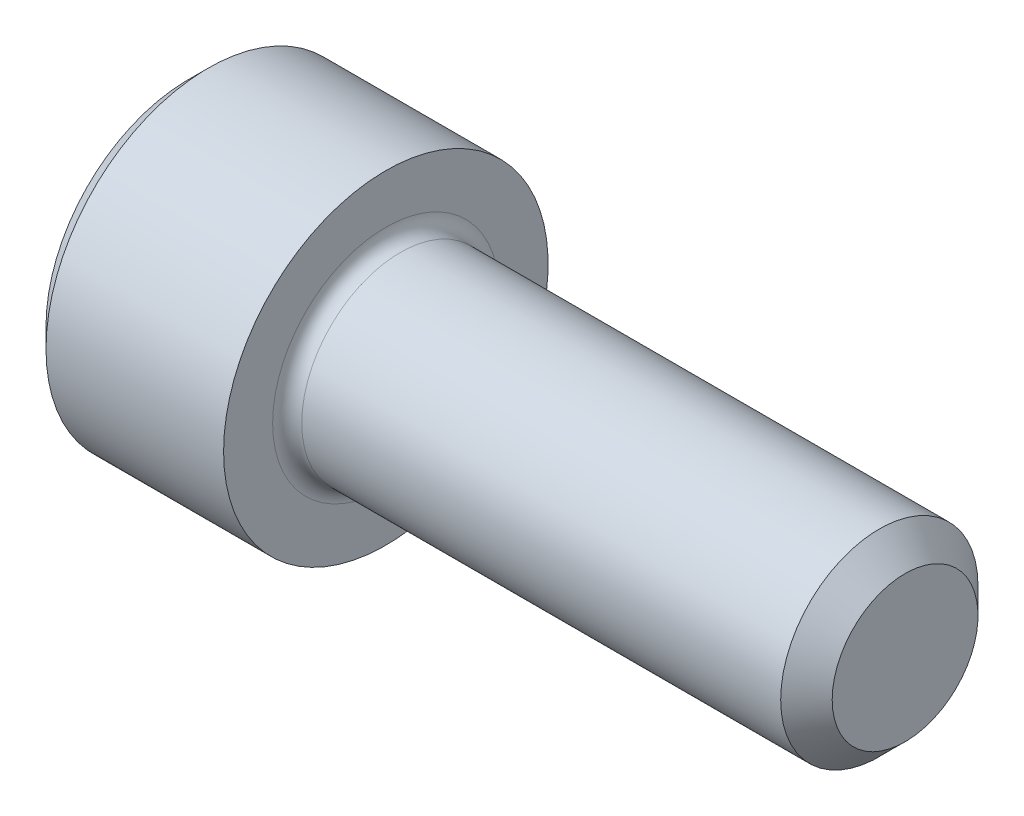
ISO-10303-21;
HEADER;
FILE_DESCRIPTION(('STEP AP214'),'2;1');
FILE_NAME('part.step','',(''),(''),'','','');
FILE_SCHEMA(('AUTOMOTIVE_DESIGN { 1 0 10303 214 1 1 1 1 }'));
ENDSEC;
DATA;
#1=APPLICATION_CONTEXT('core data for automotive mechanical design processes');
#2=APPLICATION_PROTOCOL_DEFINITION('international standard','automotive_design',2000,#1);
#3=PRODUCT_CONTEXT('',#1,'mechanical');
#4=PRODUCT('Part','Part','',(#3));
#5=PRODUCT_RELATED_PRODUCT_CATEGORY('part','',(#4));
#6=PRODUCT_DEFINITION_FORMATION('','',#4);
#7=PRODUCT_DEFINITION_CONTEXT('part definition',#1,'design');
#8=PRODUCT_DEFINITION('design','',#6,#7);
#9=PRODUCT_DEFINITION_SHAPE('','',#8);
#10=(LENGTH_UNIT() NAMED_UNIT(*) SI_UNIT(.MILLI.,.METRE.));
#11=(NAMED_UNIT(*) PLANE_ANGLE_UNIT() SI_UNIT($,.RADIAN.));
#12=(NAMED_UNIT(*) SI_UNIT($,.STERADIAN.) SOLID_ANGLE_UNIT());
#13=UNCERTAINTY_MEASURE_WITH_UNIT(LENGTH_MEASURE(1.E-05),#10,'distance_accuracy_value','');
#14=(GEOMETRIC_REPRESENTATION_CONTEXT(3) GLOBAL_UNCERTAINTY_ASSIGNED_CONTEXT((#13)) GLOBAL_UNIT_ASSIGNED_CONTEXT((#10,
#11,#12)) REPRESENTATION_CONTEXT('',''));
#15=CARTESIAN_POINT('',(0.,0.,0.));
#16=DIRECTION('',(0.,0.,1.));
#17=DIRECTION('',(1.,0.,0.));
#18=AXIS2_PLACEMENT_3D('',#15,#16,#17);
#19=CARTESIAN_POINT('',(0.,0.,0.));
#20=DIRECTION('',(-1.,0.,0.));
#21=DIRECTION('',(0.,0.,1.));
#22=AXIS2_PLACEMENT_3D('',#19,#20,#21);
#23=PLANE('',#22);
#24=DIRECTION('',(0.,-0.499999999999999,0.86602540378444));
#25=VECTOR('',#24,1.);
#26=CARTESIAN_POINT('',(0.,2.2920921156882,0.));
#27=LINE('',#26,#25);
#28=CARTESIAN_POINT('',(0.,2.2920921156882,0.));
#29=VERTEX_POINT('',#28);
#30=CARTESIAN_POINT('',(0.,1.1460460578441,1.98501000000001));
#31=VERTEX_POINT('',#30);
#32=EDGE_CURVE('E392',#29,#31,#27,.T.);
#33=ORIENTED_EDGE('',*,*,#32,.T.);
#34=DIRECTION('',(0.,1.,0.));
#35=VECTOR('',#34,1.);
#36=CARTESIAN_POINT('',(0.,-1.1460460578441,1.98501000000001));
#37=LINE('',#36,#35);
#38=CARTESIAN_POINT('',(0.,-1.1460460578441,1.98501000000001));
#39=VERTEX_POINT('',#38);
#40=EDGE_CURVE('E128',#39,#31,#37,.T.);
#41=ORIENTED_EDGE('',*,*,#40,.F.);
#42=DIRECTION('',(0.,-0.500000000000001,-0.866025403784438));
#43=VECTOR('',#42,1.);
#44=CARTESIAN_POINT('',(0.,-1.1460460578441,1.98501000000001));
#45=LINE('',#44,#43);
#46=CARTESIAN_POINT('',(0.,-2.2920921156882,0.));
#47=VERTEX_POINT('',#46);
#48=EDGE_CURVE('E395',#39,#47,#45,.T.);
#49=ORIENTED_EDGE('',*,*,#48,.T.);
#50=DIRECTION('',(0.,0.499999999999999,-0.86602540378444));
#51=VECTOR('',#50,1.);
#52=CARTESIAN_POINT('',(0.,-2.2920921156882,0.));
#53=LINE('',#52,#51);
#54=CARTESIAN_POINT('',(0.,-1.1460460578441,-1.98500999999999));
#55=VERTEX_POINT('',#54);
#56=EDGE_CURVE('E398',#47,#55,#53,.T.);
#57=ORIENTED_EDGE('',*,*,#56,.T.);
#58=DIRECTION('',(0.,-1.,0.));
#59=VECTOR('',#58,1.);
#60=CARTESIAN_POINT('',(0.,1.1460460578441,-1.98501));
#61=LINE('',#60,#59);
#62=CARTESIAN_POINT('',(0.,1.1460460578441,-1.98501));
#63=VERTEX_POINT('',#62);
#64=EDGE_CURVE('E401',#63,#55,#61,.T.);
#65=ORIENTED_EDGE('',*,*,#64,.F.);
#66=DIRECTION('',(0.,-0.500000000000001,-0.866025403784438));
#67=VECTOR('',#66,1.);
#68=CARTESIAN_POINT('',(0.,2.2920921156882,0.));
#69=LINE('',#68,#67);
#70=EDGE_CURVE('E123',#29,#63,#69,.T.);
#71=ORIENTED_EDGE('',*,*,#70,.F.);
#72=EDGE_LOOP('',(#33,#41,#49,#57,#65,#71));
#73=FACE_BOUND('',#72,.T.);
#74=CARTESIAN_POINT('',(0.,0.,0.));
#75=DIRECTION('',(-1.,0.,0.));
#76=DIRECTION('',(0.,0.,1.));
#77=AXIS2_PLACEMENT_3D('',#74,#75,#76);
#78=CIRCLE('',#77,3.48615);
#79=CARTESIAN_POINT('',(0.,0.,3.48615));
#80=VERTEX_POINT('',#79);
#81=EDGE_CURVE('E139',#80,#80,#78,.T.);
#82=ORIENTED_EDGE('',*,*,#81,.T.);
#83=EDGE_LOOP('',(#82));
#84=FACE_BOUND('',#83,.T.);
#85=ADVANCED_FACE('F36',(#73,#84),#23,.T.);
#86=CARTESIAN_POINT('',(17.526,1.78308,0.));
#87=DIRECTION('',(1.,0.,0.));
#88=DIRECTION('',(0.,0.,-1.));
#89=AXIS2_PLACEMENT_3D('',#86,#87,#88);
#90=PLANE('',#89);
#91=CARTESIAN_POINT('',(17.526,0.,0.));
#92=DIRECTION('',(-1.,0.,0.));
#93=DIRECTION('',(0.,0.,1.));
#94=AXIS2_PLACEMENT_3D('',#91,#92,#93);
#95=CIRCLE('',#94,1.78308);
#96=CARTESIAN_POINT('',(17.526,0.,1.78308));
#97=VERTEX_POINT('',#96);
#98=EDGE_CURVE('E152',#97,#97,#95,.T.);
#99=ORIENTED_EDGE('',*,*,#98,.F.);
#100=EDGE_LOOP('',(#99));
#101=FACE_BOUND('',#100,.T.);
#102=ADVANCED_FACE('F173',(#101),#90,.T.);
#103=CARTESIAN_POINT('',(17.526,0.,0.));
#104=DIRECTION('',(-1.,0.,0.));
#105=DIRECTION('',(0.,0.,1.));
#106=AXIS2_PLACEMENT_3D('',#103,#104,#105);
#107=CONICAL_SURFACE('',#106,1.78308,0.785398163397418);
#108=CARTESIAN_POINT('',(16.89608,0.,0.));
#109=DIRECTION('',(-1.,0.,0.));
#110=DIRECTION('',(0.,0.,1.));
#111=AXIS2_PLACEMENT_3D('',#108,#109,#110);
#112=CIRCLE('',#111,2.41299999999997);
#113=CARTESIAN_POINT('',(16.89608,0.,2.41299999999997));
#114=VERTEX_POINT('',#113);
#115=EDGE_CURVE('E149',#114,#114,#112,.T.);
#116=ORIENTED_EDGE('',*,*,#115,.F.);
#117=EDGE_LOOP('',(#116));
#118=FACE_BOUND('',#117,.T.);
#119=ORIENTED_EDGE('',*,*,#98,.T.);
#120=EDGE_LOOP('',(#119));
#121=FACE_BOUND('',#120,.T.);
#122=ADVANCED_FACE('F179',(#118,#121),#107,.T.);
#123=CARTESIAN_POINT('',(-31.75,0.,0.));
#124=DIRECTION('',(-1.,0.,0.));
#125=DIRECTION('',(0.,0.,1.));
#126=AXIS2_PLACEMENT_3D('',#123,#124,#125);
#127=CYLINDRICAL_SURFACE('',#126,2.41299999999998);
#128=CARTESIAN_POINT('',(5.1816,0.,0.));
#129=DIRECTION('',(1.,0.,0.));
#130=DIRECTION('',(0.,0.,-1.));
#131=AXIS2_PLACEMENT_3D('',#128,#129,#130);
#132=CIRCLE('',#131,2.41299999999998);
#133=CARTESIAN_POINT('',(5.1816,0.,-2.41299999999998));
#134=VERTEX_POINT('',#133);
#135=EDGE_CURVE('E11',#134,#134,#132,.T.);
#136=ORIENTED_EDGE('',*,*,#135,.T.);
#137=EDGE_LOOP('',(#136));
#138=FACE_BOUND('',#137,.T.);
#139=ORIENTED_EDGE('',*,*,#115,.T.);
#140=EDGE_LOOP('',(#139));
#141=FACE_BOUND('',#140,.T.);
#142=ADVANCED_FACE('F190',(#138,#141),#127,.T.);
#143=CARTESIAN_POINT('',(4.826,3.96875,0.));
#144=DIRECTION('',(1.,0.,0.));
#145=DIRECTION('',(0.,0.,-1.));
#146=AXIS2_PLACEMENT_3D('',#143,#144,#145);
#147=PLANE('',#146);
#148=CARTESIAN_POINT('',(4.826,0.,0.));
#149=DIRECTION('',(1.,0.,0.));
#150=DIRECTION('',(0.,0.,-1.));
#151=AXIS2_PLACEMENT_3D('',#148,#149,#150);
#152=CIRCLE('',#151,2.76859999999998);
#153=CARTESIAN_POINT('',(4.826,0.,-2.76859999999998));
#154=VERTEX_POINT('',#153);
#155=EDGE_CURVE('E44',#154,#154,#152,.F.);
#156=ORIENTED_EDGE('',*,*,#155,.T.);
#157=EDGE_LOOP('',(#156));
#158=FACE_BOUND('',#157,.T.);
#159=CARTESIAN_POINT('',(4.826,0.,0.));
#160=DIRECTION('',(-1.,0.,0.));
#161=DIRECTION('',(0.,0.,1.));
#162=AXIS2_PLACEMENT_3D('',#159,#160,#161);
#163=CIRCLE('',#162,3.96875);
#164=CARTESIAN_POINT('',(4.826,0.,3.96875));
#165=VERTEX_POINT('',#164);
#166=EDGE_CURVE('E146',#165,#165,#163,.T.);
#167=ORIENTED_EDGE('',*,*,#166,.F.);
#168=EDGE_LOOP('',(#167));
#169=FACE_BOUND('',#168,.T.);
#170=ADVANCED_FACE('F157',(#158,#169),#147,.T.);
#171=CARTESIAN_POINT('',(-31.75,0.,0.));
#172=DIRECTION('',(-1.,0.,0.));
#173=DIRECTION('',(0.,0.,1.));
#174=AXIS2_PLACEMENT_3D('',#171,#172,#173);
#175=CYLINDRICAL_SURFACE('',#174,3.96875);
#176=ORIENTED_EDGE('',*,*,#166,.T.);
#177=EDGE_LOOP('',(#176));
#178=FACE_BOUND('',#177,.T.);
#179=CARTESIAN_POINT('',(0.4826,0.,0.));
#180=DIRECTION('',(-1.,0.,0.));
#181=DIRECTION('',(0.,0.,1.));
#182=AXIS2_PLACEMENT_3D('',#179,#180,#181);
#183=CIRCLE('',#182,3.96875);
#184=CARTESIAN_POINT('',(0.4826,0.,3.96875));
#185=VERTEX_POINT('',#184);
#186=EDGE_CURVE('E143',#185,#185,#183,.T.);
#187=ORIENTED_EDGE('',*,*,#186,.F.);
#188=EDGE_LOOP('',(#187));
#189=FACE_BOUND('',#188,.T.);
#190=ADVANCED_FACE('F168',(#178,#189),#175,.T.);
#191=CARTESIAN_POINT('',(0.,0.,0.));
#192=DIRECTION('',(1.,0.,0.));
#193=DIRECTION('',(0.,0.,-1.));
#194=AXIS2_PLACEMENT_3D('',#191,#192,#193);
#195=CONICAL_SURFACE('',#194,3.48615,0.785398163397446);
#196=ORIENTED_EDGE('',*,*,#186,.T.);
#197=EDGE_LOOP('',(#196));
#198=FACE_BOUND('',#197,.T.);
#199=ORIENTED_EDGE('',*,*,#81,.F.);
#200=EDGE_LOOP('',(#199));
#201=FACE_BOUND('',#200,.T.);
#202=ADVANCED_FACE('F161',(#198,#201),#195,.T.);
#203=CARTESIAN_POINT('',(5.1816,0.,0.));
#204=DIRECTION('',(1.,0.,0.));
#205=DIRECTION('',(0.,0.,-1.));
#206=AXIS2_PLACEMENT_3D('',#203,#204,#205);
#207=TOROIDAL_SURFACE('',#206,2.76859999999998,0.3556);
#208=ORIENTED_EDGE('',*,*,#135,.F.);
#209=EDGE_LOOP('',(#208));
#210=FACE_BOUND('',#209,.T.);
#211=ORIENTED_EDGE('',*,*,#155,.F.);
#212=EDGE_LOOP('',(#211));
#213=FACE_BOUND('',#212,.T.);
#214=ADVANCED_FACE('F38',(#210,#213),#207,.F.);
#215=CARTESIAN_POINT('',(2.286,2.2920921156882,0.));
#216=DIRECTION('',(0.,-0.866025403784439,-0.499999999999999));
#217=DIRECTION('',(0.,0.499999999999999,-0.866025403784439));
#218=AXIS2_PLACEMENT_3D('',#215,#216,#217);
#219=PLANE('',#218);
#220=ORIENTED_EDGE('',*,*,#32,.F.);
#221=DIRECTION('',(-1.,0.,0.));
#222=VECTOR('',#221,1.);
#223=CARTESIAN_POINT('',(2.286,2.2920921156882,0.));
#224=LINE('',#223,#222);
#225=CARTESIAN_POINT('',(2.286,2.2920921156882,0.));
#226=VERTEX_POINT('',#225);
#227=EDGE_CURVE('E391',#226,#29,#224,.T.);
#228=ORIENTED_EDGE('',*,*,#227,.F.);
#229=DIRECTION('',(0.,-0.499999999999999,0.86602540378444));
#230=VECTOR('',#229,1.);
#231=CARTESIAN_POINT('',(2.286,2.2920921156882,0.));
#232=LINE('',#231,#230);
#233=CARTESIAN_POINT('',(2.286,1.71906908676615,0.992504999999997));
#234=VERTEX_POINT('',#233);
#235=EDGE_CURVE('E51',#226,#234,#232,.T.);
#236=ORIENTED_EDGE('',*,*,#235,.T.);
#237=CARTESIAN_POINT('',(2.286,1.1460460578441,1.98501000000001));
#238=VERTEX_POINT('',#237);
#239=EDGE_CURVE('E109',#234,#238,#232,.T.);
#240=ORIENTED_EDGE('',*,*,#239,.T.);
#241=DIRECTION('',(-1.,0.,0.));
#242=VECTOR('',#241,1.);
#243=CARTESIAN_POINT('',(2.286,1.1460460578441,1.98501000000001));
#244=LINE('',#243,#242);
#245=EDGE_CURVE('E121',#238,#31,#244,.T.);
#246=ORIENTED_EDGE('',*,*,#245,.T.);
#247=EDGE_LOOP('',(#220,#228,#236,#240,#246));
#248=FACE_BOUND('',#247,.T.);
#249=ADVANCED_FACE('F120',(#248),#219,.T.);
#250=CARTESIAN_POINT('',(2.286,-1.1460460578441,1.98501000000001));
#251=DIRECTION('',(0.,0.,1.));
#252=DIRECTION('',(0.,-1.,0.));
#253=AXIS2_PLACEMENT_3D('',#250,#251,#252);
#254=PLANE('',#253);
#255=ORIENTED_EDGE('',*,*,#40,.T.);
#256=ORIENTED_EDGE('',*,*,#245,.F.);
#257=DIRECTION('',(0.,1.,0.));
#258=VECTOR('',#257,1.);
#259=CARTESIAN_POINT('',(2.286,-1.1460460578441,1.98501000000001));
#260=LINE('',#259,#258);
#261=CARTESIAN_POINT('',(2.286,0.,1.98501000000001));
#262=VERTEX_POINT('',#261);
#263=EDGE_CURVE('E107',#262,#238,#260,.T.);
#264=ORIENTED_EDGE('',*,*,#263,.F.);
#265=CARTESIAN_POINT('',(2.286,-1.1460460578441,1.98501000000001));
#266=VERTEX_POINT('',#265);
#267=EDGE_CURVE('E117',#266,#262,#260,.T.);
#268=ORIENTED_EDGE('',*,*,#267,.F.);
#269=DIRECTION('',(-1.,0.,0.));
#270=VECTOR('',#269,1.);
#271=CARTESIAN_POINT('',(2.286,-1.1460460578441,1.98501000000001));
#272=LINE('',#271,#270);
#273=EDGE_CURVE('E130',#266,#39,#272,.T.);
#274=ORIENTED_EDGE('',*,*,#273,.T.);
#275=EDGE_LOOP('',(#255,#256,#264,#268,#274));
#276=FACE_BOUND('',#275,.T.);
#277=ADVANCED_FACE('F125',(#276),#254,.F.);
#278=CARTESIAN_POINT('',(2.286,-1.1460460578441,1.98501000000001));
#279=DIRECTION('',(0.,0.866025403784438,-0.500000000000001));
#280=DIRECTION('',(0.,0.500000000000001,0.866025403784438));
#281=AXIS2_PLACEMENT_3D('',#278,#279,#280);
#282=PLANE('',#281);
#283=ORIENTED_EDGE('',*,*,#48,.F.);
#284=ORIENTED_EDGE('',*,*,#273,.F.);
#285=DIRECTION('',(0.,-0.500000000000001,-0.866025403784438));
#286=VECTOR('',#285,1.);
#287=CARTESIAN_POINT('',(2.286,-1.1460460578441,1.98501000000001));
#288=LINE('',#287,#286);
#289=CARTESIAN_POINT('',(2.286,-1.71906908676615,0.992505000000004));
#290=VERTEX_POINT('',#289);
#291=EDGE_CURVE('E372',#266,#290,#288,.T.);
#292=ORIENTED_EDGE('',*,*,#291,.T.);
#293=CARTESIAN_POINT('',(2.286,-2.2920921156882,0.));
#294=VERTEX_POINT('',#293);
#295=EDGE_CURVE('E374',#290,#294,#288,.T.);
#296=ORIENTED_EDGE('',*,*,#295,.T.);
#297=DIRECTION('',(-1.,0.,0.));
#298=VECTOR('',#297,1.);
#299=CARTESIAN_POINT('',(2.286,-2.2920921156882,0.));
#300=LINE('',#299,#298);
#301=EDGE_CURVE('E135',#294,#47,#300,.T.);
#302=ORIENTED_EDGE('',*,*,#301,.T.);
#303=EDGE_LOOP('',(#283,#284,#292,#296,#302));
#304=FACE_BOUND('',#303,.T.);
#305=ADVANCED_FACE('F264',(#304),#282,.T.);
#306=CARTESIAN_POINT('',(2.286,-2.2920921156882,0.));
#307=DIRECTION('',(0.,0.866025403784439,0.499999999999998));
#308=DIRECTION('',(0.,-0.499999999999999,0.86602540378444));
#309=AXIS2_PLACEMENT_3D('',#306,#307,#308);
#310=PLANE('',#309);
#311=ORIENTED_EDGE('',*,*,#56,.F.);
#312=ORIENTED_EDGE('',*,*,#301,.F.);
#313=DIRECTION('',(0.,0.499999999999999,-0.86602540378444));
#314=VECTOR('',#313,1.);
#315=CARTESIAN_POINT('',(2.286,-2.2920921156882,0.));
#316=LINE('',#315,#314);
#317=CARTESIAN_POINT('',(2.286,-1.71906908676615,-0.992504999999996));
#318=VERTEX_POINT('',#317);
#319=EDGE_CURVE('E377',#294,#318,#316,.T.);
#320=ORIENTED_EDGE('',*,*,#319,.T.);
#321=CARTESIAN_POINT('',(2.286,-1.1460460578441,-1.98500999999999));
#322=VERTEX_POINT('',#321);
#323=EDGE_CURVE('E381',#318,#322,#316,.T.);
#324=ORIENTED_EDGE('',*,*,#323,.T.);
#325=DIRECTION('',(-1.,0.,0.));
#326=VECTOR('',#325,1.);
#327=CARTESIAN_POINT('',(2.286,-1.1460460578441,-1.98500999999999));
#328=LINE('',#327,#326);
#329=EDGE_CURVE('E410',#322,#55,#328,.T.);
#330=ORIENTED_EDGE('',*,*,#329,.T.);
#331=EDGE_LOOP('',(#311,#312,#320,#324,#330));
#332=FACE_BOUND('',#331,.T.);
#333=ADVANCED_FACE('F272',(#332),#310,.T.);
#334=CARTESIAN_POINT('',(2.286,1.1460460578441,-1.98501));
#335=DIRECTION('',(0.,0.,-1.));
#336=DIRECTION('',(0.,1.,0.));
#337=AXIS2_PLACEMENT_3D('',#334,#335,#336);
#338=PLANE('',#337);
#339=ORIENTED_EDGE('',*,*,#64,.T.);
#340=ORIENTED_EDGE('',*,*,#329,.F.);
#341=DIRECTION('',(0.,-1.,0.));
#342=VECTOR('',#341,1.);
#343=CARTESIAN_POINT('',(2.286,1.1460460578441,-1.98501));
#344=LINE('',#343,#342);
#345=CARTESIAN_POINT('',(2.286,0.,-1.98500999999999));
#346=VERTEX_POINT('',#345);
#347=EDGE_CURVE('E385',#346,#322,#344,.T.);
#348=ORIENTED_EDGE('',*,*,#347,.F.);
#349=CARTESIAN_POINT('',(2.286,1.1460460578441,-1.98501));
#350=VERTEX_POINT('',#349);
#351=EDGE_CURVE('E386',#350,#346,#344,.T.);
#352=ORIENTED_EDGE('',*,*,#351,.F.);
#353=DIRECTION('',(-1.,0.,0.));
#354=VECTOR('',#353,1.);
#355=CARTESIAN_POINT('',(2.286,1.1460460578441,-1.98501));
#356=LINE('',#355,#354);
#357=EDGE_CURVE('E407',#350,#63,#356,.T.);
#358=ORIENTED_EDGE('',*,*,#357,.T.);
#359=EDGE_LOOP('',(#339,#340,#348,#352,#358));
#360=FACE_BOUND('',#359,.T.);
#361=ADVANCED_FACE('F281',(#360),#338,.F.);
#362=CARTESIAN_POINT('',(2.286,2.2920921156882,0.));
#363=DIRECTION('',(0.,0.866025403784438,-0.500000000000001));
#364=DIRECTION('',(0.,0.500000000000001,0.866025403784438));
#365=AXIS2_PLACEMENT_3D('',#362,#363,#364);
#366=PLANE('',#365);
#367=ORIENTED_EDGE('',*,*,#70,.T.);
#368=ORIENTED_EDGE('',*,*,#357,.F.);
#369=DIRECTION('',(0.,-0.500000000000001,-0.866025403784438));
#370=VECTOR('',#369,1.);
#371=CARTESIAN_POINT('',(2.286,2.2920921156882,0.));
#372=LINE('',#371,#370);
#373=CARTESIAN_POINT('',(2.286,1.71906908676615,-0.992505000000002));
#374=VERTEX_POINT('',#373);
#375=EDGE_CURVE('E389',#374,#350,#372,.T.);
#376=ORIENTED_EDGE('',*,*,#375,.F.);
#377=EDGE_CURVE('E363',#226,#374,#372,.T.);
#378=ORIENTED_EDGE('',*,*,#377,.F.);
#379=ORIENTED_EDGE('',*,*,#227,.T.);
#380=EDGE_LOOP('',(#367,#368,#376,#378,#379));
#381=FACE_BOUND('',#380,.T.);
#382=ADVANCED_FACE('F290',(#381),#366,.F.);
#383=CARTESIAN_POINT('',(2.286,1.1460460578441,1.98501000000001));
#384=DIRECTION('',(-1.,0.,0.));
#385=DIRECTION('',(0.,0.,1.));
#386=AXIS2_PLACEMENT_3D('',#383,#384,#385);
#387=PLANE('',#386);
#388=CARTESIAN_POINT('',(2.286,0.,0.));
#389=DIRECTION('',(-1.,0.,0.));
#390=DIRECTION('',(0.,0.,1.));
#391=AXIS2_PLACEMENT_3D('',#388,#389,#390);
#392=CIRCLE('',#391,1.98501);
#393=EDGE_CURVE('E129',#290,#262,#392,.T.);
#394=ORIENTED_EDGE('',*,*,#393,.F.);
#395=ORIENTED_EDGE('',*,*,#291,.F.);
#396=ORIENTED_EDGE('',*,*,#267,.T.);
#397=EDGE_LOOP('',(#394,#395,#396));
#398=FACE_BOUND('',#397,.T.);
#399=ADVANCED_FACE('F299',(#398),#387,.T.);
#400=EDGE_CURVE('E133',#318,#290,#392,.T.);
#401=ORIENTED_EDGE('',*,*,#400,.F.);
#402=ORIENTED_EDGE('',*,*,#319,.F.);
#403=ORIENTED_EDGE('',*,*,#295,.F.);
#404=EDGE_LOOP('',(#401,#402,#403));
#405=FACE_BOUND('',#404,.T.);
#406=ADVANCED_FACE('F308',(#405),#387,.T.);
#407=EDGE_CURVE('E416',#346,#318,#392,.T.);
#408=ORIENTED_EDGE('',*,*,#407,.F.);
#409=ORIENTED_EDGE('',*,*,#347,.T.);
#410=ORIENTED_EDGE('',*,*,#323,.F.);
#411=EDGE_LOOP('',(#408,#409,#410));
#412=FACE_BOUND('',#411,.T.);
#413=ADVANCED_FACE('F317',(#412),#387,.T.);
#414=EDGE_CURVE('E366',#374,#346,#392,.T.);
#415=ORIENTED_EDGE('',*,*,#414,.F.);
#416=ORIENTED_EDGE('',*,*,#375,.T.);
#417=ORIENTED_EDGE('',*,*,#351,.T.);
#418=EDGE_LOOP('',(#415,#416,#417));
#419=FACE_BOUND('',#418,.T.);
#420=ADVANCED_FACE('F325',(#419),#387,.T.);
#421=EDGE_CURVE('E140',#234,#374,#392,.T.);
#422=ORIENTED_EDGE('',*,*,#421,.F.);
#423=ORIENTED_EDGE('',*,*,#235,.F.);
#424=ORIENTED_EDGE('',*,*,#377,.T.);
#425=EDGE_LOOP('',(#422,#423,#424));
#426=FACE_BOUND('',#425,.T.);
#427=ADVANCED_FACE('F333',(#426),#387,.T.);
#428=EDGE_CURVE('E112',#262,#234,#392,.T.);
#429=ORIENTED_EDGE('',*,*,#428,.F.);
#430=ORIENTED_EDGE('',*,*,#263,.T.);
#431=ORIENTED_EDGE('',*,*,#239,.F.);
#432=EDGE_LOOP('',(#429,#430,#431));
#433=FACE_BOUND('',#432,.T.);
#434=ADVANCED_FACE('F108',(#433),#387,.T.);
#435=CARTESIAN_POINT('',(2.286,0.,0.));
#436=DIRECTION('',(-1.,0.,0.));
#437=DIRECTION('',(0.,0.,1.));
#438=AXIS2_PLACEMENT_3D('',#435,#436,#437);
#439=CONICAL_SURFACE('',#438,1.98501,1.04719755119659);
#440=CARTESIAN_POINT('',(3.43204605784411,0.,0.));
#441=VERTEX_POINT('',#440);
#442=VERTEX_LOOP('',#441);
#443=FACE_BOUND('',#442,.T.);
#444=ORIENTED_EDGE('',*,*,#428,.T.);
#445=ORIENTED_EDGE('',*,*,#421,.T.);
#446=ORIENTED_EDGE('',*,*,#414,.T.);
#447=ORIENTED_EDGE('',*,*,#407,.T.);
#448=ORIENTED_EDGE('',*,*,#400,.T.);
#449=ORIENTED_EDGE('',*,*,#393,.T.);
#450=EDGE_LOOP('',(#444,#445,#446,#447,#448,#449));
#451=FACE_BOUND('',#450,.T.);
#452=ADVANCED_FACE('F183',(#443,#451),#439,.F.);
#453=CLOSED_SHELL('',(#85,#102,#122,#142,#170,#190,#202,#214,#249,#277,#305,#333,#361,#382,#399,
#406,#413,#420,#427,#434,#452));
#454=MANIFOLD_SOLID_BREP('B2',#453);
#455=ADVANCED_BREP_SHAPE_REPRESENTATION('',(#18,#454),#14);
#456=SHAPE_DEFINITION_REPRESENTATION(#9,#455);
ENDSEC;
END-ISO-10303-21;
